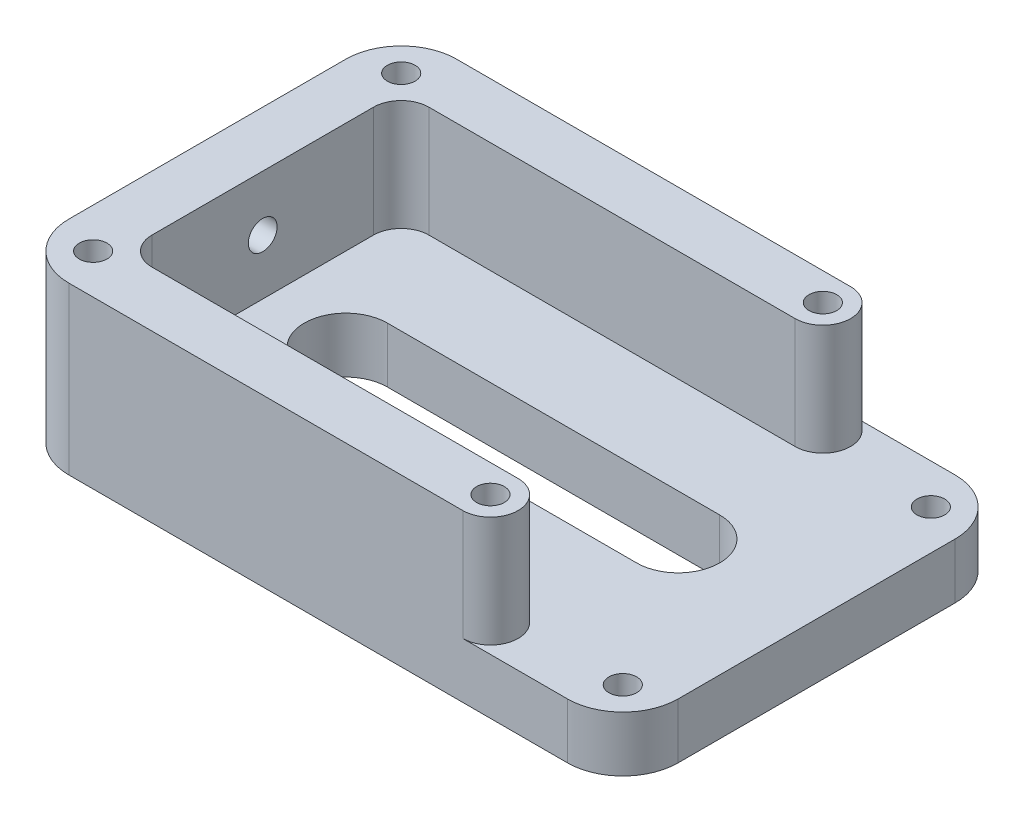
ISO-10303-21;
HEADER;
FILE_DESCRIPTION(('STEP AP214'),'2;1');
FILE_NAME('part.step','',(''),(''),'','','');
FILE_SCHEMA(('AUTOMOTIVE_DESIGN { 1 0 10303 214 1 1 1 1 }'));
ENDSEC;
DATA;
#1=APPLICATION_CONTEXT('core data for automotive mechanical design processes');
#2=APPLICATION_PROTOCOL_DEFINITION('international standard','automotive_design',2000,#1);
#3=PRODUCT_CONTEXT('',#1,'mechanical');
#4=PRODUCT('Part','Part','',(#3));
#5=PRODUCT_RELATED_PRODUCT_CATEGORY('part','',(#4));
#6=PRODUCT_DEFINITION_FORMATION('','',#4);
#7=PRODUCT_DEFINITION_CONTEXT('part definition',#1,'design');
#8=PRODUCT_DEFINITION('design','',#6,#7);
#9=PRODUCT_DEFINITION_SHAPE('','',#8);
#10=(LENGTH_UNIT() NAMED_UNIT(*) SI_UNIT(.MILLI.,.METRE.));
#11=(NAMED_UNIT(*) PLANE_ANGLE_UNIT() SI_UNIT($,.RADIAN.));
#12=(NAMED_UNIT(*) SI_UNIT($,.STERADIAN.) SOLID_ANGLE_UNIT());
#13=UNCERTAINTY_MEASURE_WITH_UNIT(LENGTH_MEASURE(1.E-05),#10,'distance_accuracy_value','');
#14=(GEOMETRIC_REPRESENTATION_CONTEXT(3) GLOBAL_UNCERTAINTY_ASSIGNED_CONTEXT((#13)) GLOBAL_UNIT_ASSIGNED_CONTEXT((#10,
#11,#12)) REPRESENTATION_CONTEXT('',''));
#15=CARTESIAN_POINT('',(0.,0.,0.));
#16=DIRECTION('',(0.,0.,1.));
#17=DIRECTION('',(1.,0.,0.));
#18=AXIS2_PLACEMENT_3D('',#15,#16,#17);
#19=CARTESIAN_POINT('',(30.,10.,0.));
#20=DIRECTION('',(0.,-1.,0.));
#21=DIRECTION('',(0.,0.,-1.));
#22=AXIS2_PLACEMENT_3D('',#19,#20,#21);
#23=CYLINDRICAL_SURFACE('',#22,7.5);
#24=CARTESIAN_POINT('',(30.,0.,0.));
#25=DIRECTION('',(0.,1.,0.));
#26=DIRECTION('',(0.,0.,1.));
#27=AXIS2_PLACEMENT_3D('',#24,#25,#26);
#28=CIRCLE('',#27,7.5);
#29=CARTESIAN_POINT('',(30.,0.,7.5));
#30=VERTEX_POINT('',#29);
#31=CARTESIAN_POINT('',(30.,0.,-7.5));
#32=VERTEX_POINT('',#31);
#33=EDGE_CURVE('E310',#30,#32,#28,.T.);
#34=ORIENTED_EDGE('',*,*,#33,.F.);
#35=DIRECTION('',(0.,-1.,0.));
#36=VECTOR('',#35,1.);
#37=CARTESIAN_POINT('',(30.,10.,7.5));
#38=LINE('',#37,#36);
#39=CARTESIAN_POINT('',(30.,10.,7.5));
#40=VERTEX_POINT('',#39);
#41=EDGE_CURVE('E11',#40,#30,#38,.T.);
#42=ORIENTED_EDGE('',*,*,#41,.F.);
#43=CARTESIAN_POINT('',(30.,10.,0.));
#44=DIRECTION('',(0.,1.,0.));
#45=DIRECTION('',(0.,0.,1.));
#46=AXIS2_PLACEMENT_3D('',#43,#44,#45);
#47=CIRCLE('',#46,7.5);
#48=CARTESIAN_POINT('',(30.,10.,-7.5));
#49=VERTEX_POINT('',#48);
#50=EDGE_CURVE('E274',#40,#49,#47,.T.);
#51=ORIENTED_EDGE('',*,*,#50,.T.);
#52=DIRECTION('',(0.,-1.,0.));
#53=VECTOR('',#52,1.);
#54=CARTESIAN_POINT('',(30.,10.,-7.5));
#55=LINE('',#54,#53);
#56=EDGE_CURVE('E327',#49,#32,#55,.T.);
#57=ORIENTED_EDGE('',*,*,#56,.T.);
#58=EDGE_LOOP('',(#34,#42,#51,#57));
#59=FACE_BOUND('',#58,.T.);
#60=ADVANCED_FACE('F40',(#59),#23,.F.);
#61=CARTESIAN_POINT('',(0.,10.,7.5));
#62=DIRECTION('',(0.,0.,-1.));
#63=DIRECTION('',(-1.,0.,0.));
#64=AXIS2_PLACEMENT_3D('',#61,#62,#63);
#65=PLANE('',#64);
#66=DIRECTION('',(1.,0.,0.));
#67=VECTOR('',#66,1.);
#68=CARTESIAN_POINT('',(0.,0.,7.5));
#69=LINE('',#68,#67);
#70=CARTESIAN_POINT('',(-30.,0.,7.5));
#71=VERTEX_POINT('',#70);
#72=EDGE_CURVE('E313',#71,#30,#69,.T.);
#73=ORIENTED_EDGE('',*,*,#72,.F.);
#74=DIRECTION('',(0.,-1.,0.));
#75=VECTOR('',#74,1.);
#76=CARTESIAN_POINT('',(-30.,10.,7.5));
#77=LINE('',#76,#75);
#78=CARTESIAN_POINT('',(-30.,10.,7.5));
#79=VERTEX_POINT('',#78);
#80=EDGE_CURVE('E49',#79,#71,#77,.T.);
#81=ORIENTED_EDGE('',*,*,#80,.F.);
#82=DIRECTION('',(1.,0.,0.));
#83=VECTOR('',#82,1.);
#84=CARTESIAN_POINT('',(0.,10.,7.5));
#85=LINE('',#84,#83);
#86=EDGE_CURVE('E277',#79,#40,#85,.T.);
#87=ORIENTED_EDGE('',*,*,#86,.T.);
#88=ORIENTED_EDGE('',*,*,#41,.T.);
#89=EDGE_LOOP('',(#73,#81,#87,#88));
#90=FACE_BOUND('',#89,.T.);
#91=ADVANCED_FACE('F412',(#90),#65,.T.);
#92=CARTESIAN_POINT('',(-30.,10.,0.));
#93=DIRECTION('',(0.,-1.,0.));
#94=DIRECTION('',(0.,0.,-1.));
#95=AXIS2_PLACEMENT_3D('',#92,#93,#94);
#96=CYLINDRICAL_SURFACE('',#95,7.5);
#97=CARTESIAN_POINT('',(-30.,0.,0.));
#98=DIRECTION('',(0.,1.,0.));
#99=DIRECTION('',(0.,0.,1.));
#100=AXIS2_PLACEMENT_3D('',#97,#98,#99);
#101=CIRCLE('',#100,7.5);
#102=CARTESIAN_POINT('',(-30.,0.,-7.5));
#103=VERTEX_POINT('',#102);
#104=EDGE_CURVE('E316',#103,#71,#101,.T.);
#105=ORIENTED_EDGE('',*,*,#104,.F.);
#106=DIRECTION('',(0.,-1.,0.));
#107=VECTOR('',#106,1.);
#108=CARTESIAN_POINT('',(-30.,10.,-7.5));
#109=LINE('',#108,#107);
#110=CARTESIAN_POINT('',(-30.,10.,-7.5));
#111=VERTEX_POINT('',#110);
#112=EDGE_CURVE('E329',#111,#103,#109,.T.);
#113=ORIENTED_EDGE('',*,*,#112,.F.);
#114=CARTESIAN_POINT('',(-30.,10.,0.));
#115=DIRECTION('',(0.,1.,0.));
#116=DIRECTION('',(0.,0.,1.));
#117=AXIS2_PLACEMENT_3D('',#114,#115,#116);
#118=CIRCLE('',#117,7.5);
#119=EDGE_CURVE('E280',#111,#79,#118,.T.);
#120=ORIENTED_EDGE('',*,*,#119,.T.);
#121=ORIENTED_EDGE('',*,*,#80,.T.);
#122=EDGE_LOOP('',(#105,#113,#120,#121));
#123=FACE_BOUND('',#122,.T.);
#124=ADVANCED_FACE('F418',(#123),#96,.F.);
#125=CARTESIAN_POINT('',(0.,10.,-35.));
#126=DIRECTION('',(0.,0.,-1.));
#127=DIRECTION('',(-1.,0.,0.));
#128=AXIS2_PLACEMENT_3D('',#125,#126,#127);
#129=PLANE('',#128);
#130=DIRECTION('',(0.,-1.,0.));
#131=VECTOR('',#130,1.);
#132=CARTESIAN_POINT('',(26.1137927144608,30.,-35.));
#133=LINE('',#132,#131);
#134=CARTESIAN_POINT('',(26.1137927144608,30.,-35.));
#135=VERTEX_POINT('',#134);
#136=CARTESIAN_POINT('',(26.1137927144608,10.,-35.));
#137=VERTEX_POINT('',#136);
#138=EDGE_CURVE('E229',#135,#137,#133,.T.);
#139=ORIENTED_EDGE('',*,*,#138,.T.);
#140=DIRECTION('',(1.,0.,0.));
#141=VECTOR('',#140,1.);
#142=CARTESIAN_POINT('',(0.,10.,-35.));
#143=LINE('',#142,#141);
#144=CARTESIAN_POINT('',(45.,10.,-35.));
#145=VERTEX_POINT('',#144);
#146=EDGE_CURVE('E262',#137,#145,#143,.T.);
#147=ORIENTED_EDGE('',*,*,#146,.T.);
#148=DIRECTION('',(0.,-1.,0.));
#149=VECTOR('',#148,1.);
#150=CARTESIAN_POINT('',(45.,10.,-35.));
#151=LINE('',#150,#149);
#152=CARTESIAN_POINT('',(45.,0.,-35.));
#153=VERTEX_POINT('',#152);
#154=EDGE_CURVE('E291',#145,#153,#151,.T.);
#155=ORIENTED_EDGE('',*,*,#154,.T.);
#156=DIRECTION('',(1.,0.,0.));
#157=VECTOR('',#156,1.);
#158=CARTESIAN_POINT('',(0.,0.,-35.));
#159=LINE('',#158,#157);
#160=CARTESIAN_POINT('',(-45.,0.,-35.));
#161=VERTEX_POINT('',#160);
#162=EDGE_CURVE('E261',#161,#153,#159,.T.);
#163=ORIENTED_EDGE('',*,*,#162,.F.);
#164=DIRECTION('',(0.,-1.,0.));
#165=VECTOR('',#164,1.);
#166=CARTESIAN_POINT('',(-45.,10.,-35.));
#167=LINE('',#166,#165);
#168=CARTESIAN_POINT('',(-45.,30.,-35.));
#169=VERTEX_POINT('',#168);
#170=EDGE_CURVE('E44',#169,#161,#167,.T.);
#171=ORIENTED_EDGE('',*,*,#170,.F.);
#172=DIRECTION('',(1.,0.,0.));
#173=VECTOR('',#172,1.);
#174=CARTESIAN_POINT('',(0.,30.,-35.));
#175=LINE('',#174,#173);
#176=EDGE_CURVE('E220',#169,#135,#175,.T.);
#177=ORIENTED_EDGE('',*,*,#176,.T.);
#178=EDGE_LOOP('',(#139,#147,#155,#163,#171,#177));
#179=FACE_BOUND('',#178,.T.);
#180=ADVANCED_FACE('F42',(#179),#129,.T.);
#181=CARTESIAN_POINT('',(-45.,10.,-25.));
#182=DIRECTION('',(0.,-1.,0.));
#183=DIRECTION('',(0.,0.,-1.));
#184=AXIS2_PLACEMENT_3D('',#181,#182,#183);
#185=CYLINDRICAL_SURFACE('',#184,9.99999999999999);
#186=CARTESIAN_POINT('',(-45.,0.,-25.));
#187=DIRECTION('',(0.,1.,0.));
#188=DIRECTION('',(0.,0.,1.));
#189=AXIS2_PLACEMENT_3D('',#186,#187,#188);
#190=CIRCLE('',#189,9.99999999999999);
#191=CARTESIAN_POINT('',(-55.,0.,-25.));
#192=VERTEX_POINT('',#191);
#193=EDGE_CURVE('E293',#161,#192,#190,.T.);
#194=ORIENTED_EDGE('',*,*,#193,.T.);
#195=DIRECTION('',(0.,-1.,0.));
#196=VECTOR('',#195,1.);
#197=CARTESIAN_POINT('',(-55.,10.,-25.));
#198=LINE('',#197,#196);
#199=CARTESIAN_POINT('',(-55.,30.,-25.));
#200=VERTEX_POINT('',#199);
#201=EDGE_CURVE('E345',#200,#192,#198,.T.);
#202=ORIENTED_EDGE('',*,*,#201,.F.);
#203=CARTESIAN_POINT('',(-45.,30.,-25.));
#204=DIRECTION('',(0.,1.,0.));
#205=DIRECTION('',(0.,0.,1.));
#206=AXIS2_PLACEMENT_3D('',#203,#204,#205);
#207=CIRCLE('',#206,9.99999999999999);
#208=EDGE_CURVE('E223',#169,#200,#207,.T.);
#209=ORIENTED_EDGE('',*,*,#208,.F.);
#210=ORIENTED_EDGE('',*,*,#170,.T.);
#211=EDGE_LOOP('',(#194,#202,#209,#210));
#212=FACE_BOUND('',#211,.T.);
#213=ADVANCED_FACE('F353',(#212),#185,.T.);
#214=CARTESIAN_POINT('',(-55.,10.,0.));
#215=DIRECTION('',(1.,0.,0.));
#216=DIRECTION('',(0.,0.,-1.));
#217=AXIS2_PLACEMENT_3D('',#214,#215,#216);
#218=PLANE('',#217);
#219=CARTESIAN_POINT('',(-55.,20.,0.));
#220=DIRECTION('',(1.,0.,0.));
#221=DIRECTION('',(0.,0.,-1.));
#222=AXIS2_PLACEMENT_3D('',#219,#220,#221);
#223=CIRCLE('',#222,2.6);
#224=CARTESIAN_POINT('',(-55.,20.,-2.6));
#225=VERTEX_POINT('',#224);
#226=EDGE_CURVE('E699',#225,#225,#223,.T.);
#227=ORIENTED_EDGE('',*,*,#226,.T.);
#228=EDGE_LOOP('',(#227));
#229=FACE_BOUND('',#228,.T.);
#230=DIRECTION('',(0.,0.,1.));
#231=VECTOR('',#230,1.);
#232=CARTESIAN_POINT('',(-55.,0.,0.));
#233=LINE('',#232,#231);
#234=CARTESIAN_POINT('',(-55.,0.,25.));
#235=VERTEX_POINT('',#234);
#236=EDGE_CURVE('E295',#192,#235,#233,.T.);
#237=ORIENTED_EDGE('',*,*,#236,.T.);
#238=DIRECTION('',(0.,-1.,0.));
#239=VECTOR('',#238,1.);
#240=CARTESIAN_POINT('',(-55.,10.,25.));
#241=LINE('',#240,#239);
#242=CARTESIAN_POINT('',(-55.,30.,25.));
#243=VERTEX_POINT('',#242);
#244=EDGE_CURVE('E343',#243,#235,#241,.T.);
#245=ORIENTED_EDGE('',*,*,#244,.F.);
#246=DIRECTION('',(0.,0.,1.));
#247=VECTOR('',#246,1.);
#248=CARTESIAN_POINT('',(-55.,30.,0.));
#249=LINE('',#248,#247);
#250=EDGE_CURVE('E226',#200,#243,#249,.T.);
#251=ORIENTED_EDGE('',*,*,#250,.F.);
#252=ORIENTED_EDGE('',*,*,#201,.T.);
#253=EDGE_LOOP('',(#237,#245,#251,#252));
#254=FACE_BOUND('',#253,.T.);
#255=ADVANCED_FACE('F378',(#229,#254),#218,.F.);
#256=CARTESIAN_POINT('',(-45.,10.,25.));
#257=DIRECTION('',(0.,-1.,0.));
#258=DIRECTION('',(0.,0.,-1.));
#259=AXIS2_PLACEMENT_3D('',#256,#257,#258);
#260=CYLINDRICAL_SURFACE('',#259,9.99999999999999);
#261=CARTESIAN_POINT('',(-45.,0.,25.));
#262=DIRECTION('',(0.,1.,0.));
#263=DIRECTION('',(0.,0.,1.));
#264=AXIS2_PLACEMENT_3D('',#261,#262,#263);
#265=CIRCLE('',#264,9.99999999999999);
#266=CARTESIAN_POINT('',(-45.,0.,35.));
#267=VERTEX_POINT('',#266);
#268=EDGE_CURVE('E297',#235,#267,#265,.T.);
#269=ORIENTED_EDGE('',*,*,#268,.T.);
#270=DIRECTION('',(0.,-1.,0.));
#271=VECTOR('',#270,1.);
#272=CARTESIAN_POINT('',(-45.,10.,35.));
#273=LINE('',#272,#271);
#274=CARTESIAN_POINT('',(-45.,30.,35.));
#275=VERTEX_POINT('',#274);
#276=EDGE_CURVE('E341',#275,#267,#273,.T.);
#277=ORIENTED_EDGE('',*,*,#276,.F.);
#278=CARTESIAN_POINT('',(-45.,30.,25.));
#279=DIRECTION('',(0.,1.,0.));
#280=DIRECTION('',(0.,0.,1.));
#281=AXIS2_PLACEMENT_3D('',#278,#279,#280);
#282=CIRCLE('',#281,9.99999999999999);
#283=EDGE_CURVE('E186',#243,#275,#282,.T.);
#284=ORIENTED_EDGE('',*,*,#283,.F.);
#285=ORIENTED_EDGE('',*,*,#244,.T.);
#286=EDGE_LOOP('',(#269,#277,#284,#285));
#287=FACE_BOUND('',#286,.T.);
#288=ADVANCED_FACE('F377',(#287),#260,.T.);
#289=CARTESIAN_POINT('',(0.,10.,35.));
#290=DIRECTION('',(0.,0.,-1.));
#291=DIRECTION('',(-1.,0.,0.));
#292=AXIS2_PLACEMENT_3D('',#289,#290,#291);
#293=PLANE('',#292);
#294=DIRECTION('',(1.,0.,0.));
#295=VECTOR('',#294,1.);
#296=CARTESIAN_POINT('',(0.,10.,35.));
#297=LINE('',#296,#295);
#298=CARTESIAN_POINT('',(26.1137927144608,10.,35.));
#299=VERTEX_POINT('',#298);
#300=CARTESIAN_POINT('',(45.,10.,35.));
#301=VERTEX_POINT('',#300);
#302=EDGE_CURVE('E196',#299,#301,#297,.T.);
#303=ORIENTED_EDGE('',*,*,#302,.F.);
#304=DIRECTION('',(0.,-1.,0.));
#305=VECTOR('',#304,1.);
#306=CARTESIAN_POINT('',(26.1137927144608,30.,35.));
#307=LINE('',#306,#305);
#308=CARTESIAN_POINT('',(26.1137927144608,30.,35.));
#309=VERTEX_POINT('',#308);
#310=EDGE_CURVE('E193',#309,#299,#307,.T.);
#311=ORIENTED_EDGE('',*,*,#310,.F.);
#312=DIRECTION('',(1.,0.,0.));
#313=VECTOR('',#312,1.);
#314=CARTESIAN_POINT('',(0.,30.,35.));
#315=LINE('',#314,#313);
#316=EDGE_CURVE('E177',#275,#309,#315,.T.);
#317=ORIENTED_EDGE('',*,*,#316,.F.);
#318=ORIENTED_EDGE('',*,*,#276,.T.);
#319=DIRECTION('',(1.,0.,0.));
#320=VECTOR('',#319,1.);
#321=CARTESIAN_POINT('',(0.,0.,35.));
#322=LINE('',#321,#320);
#323=CARTESIAN_POINT('',(45.,0.,35.));
#324=VERTEX_POINT('',#323);
#325=EDGE_CURVE('E299',#267,#324,#322,.T.);
#326=ORIENTED_EDGE('',*,*,#325,.T.);
#327=DIRECTION('',(0.,-1.,0.));
#328=VECTOR('',#327,1.);
#329=CARTESIAN_POINT('',(45.,10.,35.));
#330=LINE('',#329,#328);
#331=EDGE_CURVE('E338',#301,#324,#330,.T.);
#332=ORIENTED_EDGE('',*,*,#331,.F.);
#333=EDGE_LOOP('',(#303,#311,#317,#318,#326,#332));
#334=FACE_BOUND('',#333,.T.);
#335=ADVANCED_FACE('F194',(#334),#293,.F.);
#336=CARTESIAN_POINT('',(45.,10.,25.));
#337=DIRECTION('',(0.,-1.,0.));
#338=DIRECTION('',(0.,0.,-1.));
#339=AXIS2_PLACEMENT_3D('',#336,#337,#338);
#340=CYLINDRICAL_SURFACE('',#339,10.);
#341=CARTESIAN_POINT('',(45.,0.,25.));
#342=DIRECTION('',(0.,1.,0.));
#343=DIRECTION('',(0.,0.,1.));
#344=AXIS2_PLACEMENT_3D('',#341,#342,#343);
#345=CIRCLE('',#344,10.);
#346=CARTESIAN_POINT('',(55.,0.,25.));
#347=VERTEX_POINT('',#346);
#348=EDGE_CURVE('E301',#324,#347,#345,.T.);
#349=ORIENTED_EDGE('',*,*,#348,.T.);
#350=DIRECTION('',(0.,-1.,0.));
#351=VECTOR('',#350,1.);
#352=CARTESIAN_POINT('',(55.,10.,25.));
#353=LINE('',#352,#351);
#354=CARTESIAN_POINT('',(55.,10.,25.));
#355=VERTEX_POINT('',#354);
#356=EDGE_CURVE('E336',#355,#347,#353,.T.);
#357=ORIENTED_EDGE('',*,*,#356,.F.);
#358=CARTESIAN_POINT('',(45.,10.,25.));
#359=DIRECTION('',(0.,1.,0.));
#360=DIRECTION('',(0.,0.,1.));
#361=AXIS2_PLACEMENT_3D('',#358,#359,#360);
#362=CIRCLE('',#361,10.);
#363=EDGE_CURVE('E266',#301,#355,#362,.T.);
#364=ORIENTED_EDGE('',*,*,#363,.F.);
#365=ORIENTED_EDGE('',*,*,#331,.T.);
#366=EDGE_LOOP('',(#349,#357,#364,#365));
#367=FACE_BOUND('',#366,.T.);
#368=ADVANCED_FACE('F375',(#367),#340,.T.);
#369=CARTESIAN_POINT('',(55.,10.,0.));
#370=DIRECTION('',(1.,0.,0.));
#371=DIRECTION('',(0.,0.,-1.));
#372=AXIS2_PLACEMENT_3D('',#369,#370,#371);
#373=PLANE('',#372);
#374=DIRECTION('',(0.,0.,1.));
#375=VECTOR('',#374,1.);
#376=CARTESIAN_POINT('',(55.,0.,0.));
#377=LINE('',#376,#375);
#378=CARTESIAN_POINT('',(55.,0.,-25.));
#379=VERTEX_POINT('',#378);
#380=EDGE_CURVE('E304',#379,#347,#377,.T.);
#381=ORIENTED_EDGE('',*,*,#380,.F.);
#382=DIRECTION('',(0.,-1.,0.));
#383=VECTOR('',#382,1.);
#384=CARTESIAN_POINT('',(55.,10.,-25.));
#385=LINE('',#384,#383);
#386=CARTESIAN_POINT('',(55.,10.,-25.));
#387=VERTEX_POINT('',#386);
#388=EDGE_CURVE('E334',#387,#379,#385,.T.);
#389=ORIENTED_EDGE('',*,*,#388,.F.);
#390=DIRECTION('',(0.,0.,1.));
#391=VECTOR('',#390,1.);
#392=CARTESIAN_POINT('',(55.,10.,0.));
#393=LINE('',#392,#391);
#394=EDGE_CURVE('E268',#387,#355,#393,.T.);
#395=ORIENTED_EDGE('',*,*,#394,.T.);
#396=ORIENTED_EDGE('',*,*,#356,.T.);
#397=EDGE_LOOP('',(#381,#389,#395,#396));
#398=FACE_BOUND('',#397,.T.);
#399=ADVANCED_FACE('F370',(#398),#373,.T.);
#400=CARTESIAN_POINT('',(47.8033008588991,10.,-27.8033008588991));
#401=DIRECTION('',(0.,-1.,0.));
#402=DIRECTION('',(0.,0.,-1.));
#403=AXIS2_PLACEMENT_3D('',#400,#401,#402);
#404=CYLINDRICAL_SURFACE('',#403,2.5);
#405=CARTESIAN_POINT('',(47.8033008588991,10.,-27.8033008588991));
#406=DIRECTION('',(0.,1.,0.));
#407=DIRECTION('',(0.,0.,1.));
#408=AXIS2_PLACEMENT_3D('',#405,#406,#407);
#409=CIRCLE('',#408,2.5);
#410=CARTESIAN_POINT('',(47.8033008588991,10.,-25.3033008588991));
#411=VERTEX_POINT('',#410);
#412=EDGE_CURVE('E285',#411,#411,#409,.T.);
#413=ORIENTED_EDGE('',*,*,#412,.T.);
#414=EDGE_LOOP('',(#413));
#415=FACE_BOUND('',#414,.T.);
#416=CARTESIAN_POINT('',(47.8033008588991,0.,-27.8033008588991));
#417=DIRECTION('',(0.,1.,0.));
#418=DIRECTION('',(0.,0.,1.));
#419=AXIS2_PLACEMENT_3D('',#416,#417,#418);
#420=CIRCLE('',#419,2.5);
#421=CARTESIAN_POINT('',(47.8033008588991,0.,-25.3033008588991));
#422=VERTEX_POINT('',#421);
#423=EDGE_CURVE('E322',#422,#422,#420,.T.);
#424=ORIENTED_EDGE('',*,*,#423,.F.);
#425=EDGE_LOOP('',(#424));
#426=FACE_BOUND('',#425,.T.);
#427=ADVANCED_FACE('F430',(#415,#426),#404,.F.);
#428=CARTESIAN_POINT('',(0.,10.,-7.5));
#429=DIRECTION('',(0.,0.,-1.));
#430=DIRECTION('',(-1.,0.,0.));
#431=AXIS2_PLACEMENT_3D('',#428,#429,#430);
#432=PLANE('',#431);
#433=DIRECTION('',(1.,0.,0.));
#434=VECTOR('',#433,1.);
#435=CARTESIAN_POINT('',(0.,0.,-7.5));
#436=LINE('',#435,#434);
#437=EDGE_CURVE('E319',#103,#32,#436,.T.);
#438=ORIENTED_EDGE('',*,*,#437,.T.);
#439=ORIENTED_EDGE('',*,*,#56,.F.);
#440=DIRECTION('',(1.,0.,0.));
#441=VECTOR('',#440,1.);
#442=CARTESIAN_POINT('',(0.,10.,-7.5));
#443=LINE('',#442,#441);
#444=EDGE_CURVE('E283',#111,#49,#443,.T.);
#445=ORIENTED_EDGE('',*,*,#444,.F.);
#446=ORIENTED_EDGE('',*,*,#112,.T.);
#447=EDGE_LOOP('',(#438,#439,#445,#446));
#448=FACE_BOUND('',#447,.T.);
#449=ADVANCED_FACE('F427',(#448),#432,.F.);
#450=CARTESIAN_POINT('',(45.,10.,-25.));
#451=DIRECTION('',(0.,-1.,0.));
#452=DIRECTION('',(0.,0.,-1.));
#453=AXIS2_PLACEMENT_3D('',#450,#451,#452);
#454=CYLINDRICAL_SURFACE('',#453,10.);
#455=CARTESIAN_POINT('',(45.,0.,-25.));
#456=DIRECTION('',(0.,1.,0.));
#457=DIRECTION('',(0.,0.,1.));
#458=AXIS2_PLACEMENT_3D('',#455,#456,#457);
#459=CIRCLE('',#458,10.);
#460=EDGE_CURVE('E307',#153,#379,#459,.F.);
#461=ORIENTED_EDGE('',*,*,#460,.F.);
#462=ORIENTED_EDGE('',*,*,#154,.F.);
#463=CARTESIAN_POINT('',(45.,10.,-25.));
#464=DIRECTION('',(0.,1.,0.));
#465=DIRECTION('',(0.,0.,1.));
#466=AXIS2_PLACEMENT_3D('',#463,#464,#465);
#467=CIRCLE('',#466,10.);
#468=EDGE_CURVE('E271',#145,#387,#467,.F.);
#469=ORIENTED_EDGE('',*,*,#468,.T.);
#470=ORIENTED_EDGE('',*,*,#388,.T.);
#471=EDGE_LOOP('',(#461,#462,#469,#470));
#472=FACE_BOUND('',#471,.T.);
#473=ADVANCED_FACE('F366',(#472),#454,.T.);
#474=CARTESIAN_POINT('',(47.8033008588991,10.,27.8033008588991));
#475=DIRECTION('',(0.,-1.,0.));
#476=DIRECTION('',(0.,0.,-1.));
#477=AXIS2_PLACEMENT_3D('',#474,#475,#476);
#478=CYLINDRICAL_SURFACE('',#477,2.5);
#479=CARTESIAN_POINT('',(47.8033008588991,10.,27.8033008588991));
#480=DIRECTION('',(0.,1.,0.));
#481=DIRECTION('',(0.,0.,1.));
#482=AXIS2_PLACEMENT_3D('',#479,#480,#481);
#483=CIRCLE('',#482,2.5);
#484=CARTESIAN_POINT('',(47.8033008588991,10.,30.3033008588991));
#485=VERTEX_POINT('',#484);
#486=EDGE_CURVE('E288',#485,#485,#483,.F.);
#487=ORIENTED_EDGE('',*,*,#486,.F.);
#488=EDGE_LOOP('',(#487));
#489=FACE_BOUND('',#488,.T.);
#490=CARTESIAN_POINT('',(47.8033008588991,0.,27.8033008588991));
#491=DIRECTION('',(0.,1.,0.));
#492=DIRECTION('',(0.,0.,1.));
#493=AXIS2_PLACEMENT_3D('',#490,#491,#492);
#494=CIRCLE('',#493,2.5);
#495=CARTESIAN_POINT('',(47.8033008588991,0.,30.3033008588991));
#496=VERTEX_POINT('',#495);
#497=EDGE_CURVE('E264',#496,#496,#494,.F.);
#498=ORIENTED_EDGE('',*,*,#497,.T.);
#499=EDGE_LOOP('',(#498));
#500=FACE_BOUND('',#499,.T.);
#501=ADVANCED_FACE('F426',(#489,#500),#478,.F.);
#502=CARTESIAN_POINT('',(0.,10.,0.));
#503=DIRECTION('',(0.,1.,0.));
#504=DIRECTION('',(0.,0.,1.));
#505=AXIS2_PLACEMENT_3D('',#502,#503,#504);
#506=PLANE('',#505);
#507=CARTESIAN_POINT('',(26.1137927144608,10.,30.));
#508=DIRECTION('',(0.,1.,0.));
#509=DIRECTION('',(0.,0.,1.));
#510=AXIS2_PLACEMENT_3D('',#507,#508,#509);
#511=CIRCLE('',#510,5.00000000000001);
#512=CARTESIAN_POINT('',(26.1137927144608,10.,25.));
#513=VERTEX_POINT('',#512);
#514=EDGE_CURVE('E259',#299,#513,#511,.T.);
#515=ORIENTED_EDGE('',*,*,#514,.F.);
#516=ORIENTED_EDGE('',*,*,#302,.T.);
#517=ORIENTED_EDGE('',*,*,#363,.T.);
#518=ORIENTED_EDGE('',*,*,#394,.F.);
#519=ORIENTED_EDGE('',*,*,#468,.F.);
#520=ORIENTED_EDGE('',*,*,#146,.F.);
#521=CARTESIAN_POINT('',(26.1137927144608,10.,-30.));
#522=DIRECTION('',(0.,1.,0.));
#523=DIRECTION('',(0.,0.,1.));
#524=AXIS2_PLACEMENT_3D('',#521,#522,#523);
#525=CIRCLE('',#524,5.00000000000001);
#526=CARTESIAN_POINT('',(26.1137927144608,10.,-25.));
#527=VERTEX_POINT('',#526);
#528=EDGE_CURVE('E198',#137,#527,#525,.F.);
#529=ORIENTED_EDGE('',*,*,#528,.T.);
#530=DIRECTION('',(-1.,0.,0.));
#531=VECTOR('',#530,1.);
#532=CARTESIAN_POINT('',(0.,10.,-25.));
#533=LINE('',#532,#531);
#534=CARTESIAN_POINT('',(-40.,10.,-25.));
#535=VERTEX_POINT('',#534);
#536=EDGE_CURVE('E249',#527,#535,#533,.T.);
#537=ORIENTED_EDGE('',*,*,#536,.T.);
#538=CARTESIAN_POINT('',(-40.,10.,-20.));
#539=DIRECTION('',(0.,1.,0.));
#540=DIRECTION('',(0.,0.,1.));
#541=AXIS2_PLACEMENT_3D('',#538,#539,#540);
#542=CIRCLE('',#541,5.);
#543=CARTESIAN_POINT('',(-45.,10.,-20.));
#544=VERTEX_POINT('',#543);
#545=EDGE_CURVE('E251',#544,#535,#542,.F.);
#546=ORIENTED_EDGE('',*,*,#545,.F.);
#547=DIRECTION('',(0.,0.,-1.));
#548=VECTOR('',#547,1.);
#549=CARTESIAN_POINT('',(-45.,10.,0.));
#550=LINE('',#549,#548);
#551=CARTESIAN_POINT('',(-45.,10.,20.));
#552=VERTEX_POINT('',#551);
#553=EDGE_CURVE('E254',#552,#544,#550,.T.);
#554=ORIENTED_EDGE('',*,*,#553,.F.);
#555=CARTESIAN_POINT('',(-40.,10.,20.));
#556=DIRECTION('',(0.,1.,0.));
#557=DIRECTION('',(0.,0.,1.));
#558=AXIS2_PLACEMENT_3D('',#555,#556,#557);
#559=CIRCLE('',#558,5.);
#560=CARTESIAN_POINT('',(-40.,10.,25.));
#561=VERTEX_POINT('',#560);
#562=EDGE_CURVE('E62',#552,#561,#559,.T.);
#563=ORIENTED_EDGE('',*,*,#562,.T.);
#564=DIRECTION('',(-1.,0.,0.));
#565=VECTOR('',#564,1.);
#566=CARTESIAN_POINT('',(0.,10.,25.));
#567=LINE('',#566,#565);
#568=EDGE_CURVE('E57',#513,#561,#567,.T.);
#569=ORIENTED_EDGE('',*,*,#568,.F.);
#570=EDGE_LOOP('',(#515,#516,#517,#518,#519,#520,#529,#537,#546,#554,#563,#569));
#571=FACE_BOUND('',#570,.T.);
#572=ORIENTED_EDGE('',*,*,#50,.F.);
#573=ORIENTED_EDGE('',*,*,#86,.F.);
#574=ORIENTED_EDGE('',*,*,#119,.F.);
#575=ORIENTED_EDGE('',*,*,#444,.T.);
#576=EDGE_LOOP('',(#572,#573,#574,#575));
#577=FACE_BOUND('',#576,.T.);
#578=ORIENTED_EDGE('',*,*,#412,.F.);
#579=EDGE_LOOP('',(#578));
#580=FACE_BOUND('',#579,.T.);
#581=ORIENTED_EDGE('',*,*,#486,.T.);
#582=EDGE_LOOP('',(#581));
#583=FACE_BOUND('',#582,.T.);
#584=ADVANCED_FACE('F386',(#571,#577,#580,#583),#506,.T.);
#585=CARTESIAN_POINT('',(0.,0.,0.));
#586=DIRECTION('',(0.,1.,0.));
#587=DIRECTION('',(0.,0.,1.));
#588=AXIS2_PLACEMENT_3D('',#585,#586,#587);
#589=PLANE('',#588);
#590=CARTESIAN_POINT('',(-47.8033008588991,0.,27.8033008588991));
#591=DIRECTION('',(0.,1.,0.));
#592=DIRECTION('',(0.,0.,-1.));
#593=AXIS2_PLACEMENT_3D('',#590,#591,#592);
#594=CIRCLE('',#593,2.5);
#595=CARTESIAN_POINT('',(-47.8033008588991,0.,25.3033008588991));
#596=VERTEX_POINT('',#595);
#597=EDGE_CURVE('E711',#596,#596,#594,.T.);
#598=ORIENTED_EDGE('',*,*,#597,.T.);
#599=EDGE_LOOP('',(#598));
#600=FACE_BOUND('',#599,.T.);
#601=CARTESIAN_POINT('',(26.1137927144608,0.,-30.));
#602=DIRECTION('',(0.,1.,0.));
#603=DIRECTION('',(0.,0.,1.));
#604=AXIS2_PLACEMENT_3D('',#601,#602,#603);
#605=CIRCLE('',#604,2.5);
#606=CARTESIAN_POINT('',(26.1137927144608,0.,-27.5));
#607=VERTEX_POINT('',#606);
#608=EDGE_CURVE('E718',#607,#607,#605,.T.);
#609=ORIENTED_EDGE('',*,*,#608,.T.);
#610=EDGE_LOOP('',(#609));
#611=FACE_BOUND('',#610,.T.);
#612=CARTESIAN_POINT('',(26.1137927144608,0.,30.));
#613=DIRECTION('',(0.,1.,0.));
#614=DIRECTION('',(0.,0.,-1.));
#615=AXIS2_PLACEMENT_3D('',#612,#613,#614);
#616=CIRCLE('',#615,2.5);
#617=CARTESIAN_POINT('',(26.1137927144608,0.,27.5));
#618=VERTEX_POINT('',#617);
#619=EDGE_CURVE('E705',#618,#618,#616,.T.);
#620=ORIENTED_EDGE('',*,*,#619,.T.);
#621=EDGE_LOOP('',(#620));
#622=FACE_BOUND('',#621,.T.);
#623=CARTESIAN_POINT('',(-47.8033008588991,0.,-27.8033008588991));
#624=DIRECTION('',(0.,1.,0.));
#625=DIRECTION('',(0.,0.,1.));
#626=AXIS2_PLACEMENT_3D('',#623,#624,#625);
#627=CIRCLE('',#626,2.5);
#628=CARTESIAN_POINT('',(-47.8033008588991,0.,-25.3033008588991));
#629=VERTEX_POINT('',#628);
#630=EDGE_CURVE('E189',#629,#629,#627,.T.);
#631=ORIENTED_EDGE('',*,*,#630,.T.);
#632=EDGE_LOOP('',(#631));
#633=FACE_BOUND('',#632,.T.);
#634=ORIENTED_EDGE('',*,*,#348,.F.);
#635=ORIENTED_EDGE('',*,*,#325,.F.);
#636=ORIENTED_EDGE('',*,*,#268,.F.);
#637=ORIENTED_EDGE('',*,*,#236,.F.);
#638=ORIENTED_EDGE('',*,*,#193,.F.);
#639=ORIENTED_EDGE('',*,*,#162,.T.);
#640=ORIENTED_EDGE('',*,*,#460,.T.);
#641=ORIENTED_EDGE('',*,*,#380,.T.);
#642=EDGE_LOOP('',(#634,#635,#636,#637,#638,#639,#640,#641));
#643=FACE_BOUND('',#642,.T.);
#644=ORIENTED_EDGE('',*,*,#33,.T.);
#645=ORIENTED_EDGE('',*,*,#437,.F.);
#646=ORIENTED_EDGE('',*,*,#104,.T.);
#647=ORIENTED_EDGE('',*,*,#72,.T.);
#648=EDGE_LOOP('',(#644,#645,#646,#647));
#649=FACE_BOUND('',#648,.T.);
#650=ORIENTED_EDGE('',*,*,#423,.T.);
#651=EDGE_LOOP('',(#650));
#652=FACE_BOUND('',#651,.T.);
#653=ORIENTED_EDGE('',*,*,#497,.F.);
#654=EDGE_LOOP('',(#653));
#655=FACE_BOUND('',#654,.T.);
#656=ADVANCED_FACE('F359',(#600,#611,#622,#633,#643,#649,#652,#655),#589,.F.);
#657=CARTESIAN_POINT('',(26.1137927144608,30.,30.));
#658=DIRECTION('',(0.,-1.,0.));
#659=DIRECTION('',(0.,0.,-1.));
#660=AXIS2_PLACEMENT_3D('',#657,#658,#659);
#661=CYLINDRICAL_SURFACE('',#660,5.00000000000001);
#662=ORIENTED_EDGE('',*,*,#310,.T.);
#663=ORIENTED_EDGE('',*,*,#514,.T.);
#664=DIRECTION('',(0.,-1.,0.));
#665=VECTOR('',#664,1.);
#666=CARTESIAN_POINT('',(26.1137927144608,30.,25.));
#667=LINE('',#666,#665);
#668=CARTESIAN_POINT('',(26.1137927144608,30.,25.));
#669=VERTEX_POINT('',#668);
#670=EDGE_CURVE('E199',#669,#513,#667,.T.);
#671=ORIENTED_EDGE('',*,*,#670,.F.);
#672=CARTESIAN_POINT('',(26.1137927144608,30.,30.));
#673=DIRECTION('',(0.,1.,0.));
#674=DIRECTION('',(0.,0.,1.));
#675=AXIS2_PLACEMENT_3D('',#672,#673,#674);
#676=CIRCLE('',#675,5.00000000000001);
#677=EDGE_CURVE('E182',#669,#309,#676,.F.);
#678=ORIENTED_EDGE('',*,*,#677,.T.);
#679=EDGE_LOOP('',(#662,#663,#671,#678));
#680=FACE_BOUND('',#679,.T.);
#681=ADVANCED_FACE('F201',(#680),#661,.T.);
#682=CARTESIAN_POINT('',(0.,30.,25.));
#683=DIRECTION('',(0.,0.,-1.));
#684=DIRECTION('',(-1.,0.,0.));
#685=AXIS2_PLACEMENT_3D('',#682,#683,#684);
#686=PLANE('',#685);
#687=ORIENTED_EDGE('',*,*,#670,.T.);
#688=ORIENTED_EDGE('',*,*,#568,.T.);
#689=DIRECTION('',(0.,-1.,0.));
#690=VECTOR('',#689,1.);
#691=CARTESIAN_POINT('',(-40.,30.,25.));
#692=LINE('',#691,#690);
#693=CARTESIAN_POINT('',(-40.,30.,25.));
#694=VERTEX_POINT('',#693);
#695=EDGE_CURVE('E244',#694,#561,#692,.T.);
#696=ORIENTED_EDGE('',*,*,#695,.F.);
#697=DIRECTION('',(1.,0.,0.));
#698=VECTOR('',#697,1.);
#699=CARTESIAN_POINT('',(0.,30.,25.));
#700=LINE('',#699,#698);
#701=EDGE_CURVE('E203',#694,#669,#700,.T.);
#702=ORIENTED_EDGE('',*,*,#701,.T.);
#703=EDGE_LOOP('',(#687,#688,#696,#702));
#704=FACE_BOUND('',#703,.T.);
#705=ADVANCED_FACE('F402',(#704),#686,.T.);
#706=CARTESIAN_POINT('',(-40.,30.,20.));
#707=DIRECTION('',(0.,-1.,0.));
#708=DIRECTION('',(0.,0.,-1.));
#709=AXIS2_PLACEMENT_3D('',#706,#707,#708);
#710=CYLINDRICAL_SURFACE('',#709,5.);
#711=ORIENTED_EDGE('',*,*,#562,.F.);
#712=DIRECTION('',(0.,-1.,0.));
#713=VECTOR('',#712,1.);
#714=CARTESIAN_POINT('',(-45.,30.,20.));
#715=LINE('',#714,#713);
#716=CARTESIAN_POINT('',(-45.,30.,20.));
#717=VERTEX_POINT('',#716);
#718=EDGE_CURVE('E241',#717,#552,#715,.T.);
#719=ORIENTED_EDGE('',*,*,#718,.F.);
#720=CARTESIAN_POINT('',(-40.,30.,20.));
#721=DIRECTION('',(0.,1.,0.));
#722=DIRECTION('',(0.,0.,1.));
#723=AXIS2_PLACEMENT_3D('',#720,#721,#722);
#724=CIRCLE('',#723,5.);
#725=EDGE_CURVE('E205',#694,#717,#724,.F.);
#726=ORIENTED_EDGE('',*,*,#725,.F.);
#727=ORIENTED_EDGE('',*,*,#695,.T.);
#728=EDGE_LOOP('',(#711,#719,#726,#727));
#729=FACE_BOUND('',#728,.T.);
#730=ADVANCED_FACE('F400',(#729),#710,.F.);
#731=CARTESIAN_POINT('',(-45.,30.,0.));
#732=DIRECTION('',(1.,0.,0.));
#733=DIRECTION('',(0.,0.,-1.));
#734=AXIS2_PLACEMENT_3D('',#731,#732,#733);
#735=PLANE('',#734);
#736=CARTESIAN_POINT('',(-45.,20.,0.));
#737=DIRECTION('',(1.,0.,0.));
#738=DIRECTION('',(0.,0.,-1.));
#739=AXIS2_PLACEMENT_3D('',#736,#737,#738);
#740=CIRCLE('',#739,2.6);
#741=CARTESIAN_POINT('',(-45.,20.,-2.6));
#742=VERTEX_POINT('',#741);
#743=EDGE_CURVE('E698',#742,#742,#740,.T.);
#744=ORIENTED_EDGE('',*,*,#743,.F.);
#745=EDGE_LOOP('',(#744));
#746=FACE_BOUND('',#745,.T.);
#747=ORIENTED_EDGE('',*,*,#718,.T.);
#748=ORIENTED_EDGE('',*,*,#553,.T.);
#749=DIRECTION('',(0.,-1.,0.));
#750=VECTOR('',#749,1.);
#751=CARTESIAN_POINT('',(-45.,30.,-20.));
#752=LINE('',#751,#750);
#753=CARTESIAN_POINT('',(-45.,30.,-20.));
#754=VERTEX_POINT('',#753);
#755=EDGE_CURVE('E238',#754,#544,#752,.T.);
#756=ORIENTED_EDGE('',*,*,#755,.F.);
#757=DIRECTION('',(0.,0.,1.));
#758=VECTOR('',#757,1.);
#759=CARTESIAN_POINT('',(-45.,30.,0.));
#760=LINE('',#759,#758);
#761=EDGE_CURVE('E210',#754,#717,#760,.T.);
#762=ORIENTED_EDGE('',*,*,#761,.T.);
#763=EDGE_LOOP('',(#747,#748,#756,#762));
#764=FACE_BOUND('',#763,.T.);
#765=ADVANCED_FACE('F395',(#746,#764),#735,.T.);
#766=CARTESIAN_POINT('',(-40.,30.,-20.));
#767=DIRECTION('',(0.,-1.,0.));
#768=DIRECTION('',(0.,0.,-1.));
#769=AXIS2_PLACEMENT_3D('',#766,#767,#768);
#770=CYLINDRICAL_SURFACE('',#769,5.);
#771=ORIENTED_EDGE('',*,*,#755,.T.);
#772=ORIENTED_EDGE('',*,*,#545,.T.);
#773=DIRECTION('',(0.,-1.,0.));
#774=VECTOR('',#773,1.);
#775=CARTESIAN_POINT('',(-40.,30.,-25.));
#776=LINE('',#775,#774);
#777=CARTESIAN_POINT('',(-40.,30.,-25.));
#778=VERTEX_POINT('',#777);
#779=EDGE_CURVE('E235',#778,#535,#776,.T.);
#780=ORIENTED_EDGE('',*,*,#779,.F.);
#781=CARTESIAN_POINT('',(-40.,30.,-20.));
#782=DIRECTION('',(0.,1.,0.));
#783=DIRECTION('',(0.,0.,1.));
#784=AXIS2_PLACEMENT_3D('',#781,#782,#783);
#785=CIRCLE('',#784,5.);
#786=EDGE_CURVE('E213',#778,#754,#785,.T.);
#787=ORIENTED_EDGE('',*,*,#786,.T.);
#788=EDGE_LOOP('',(#771,#772,#780,#787));
#789=FACE_BOUND('',#788,.T.);
#790=ADVANCED_FACE('F393',(#789),#770,.F.);
#791=CARTESIAN_POINT('',(0.,30.,-25.));
#792=DIRECTION('',(0.,0.,-1.));
#793=DIRECTION('',(-1.,0.,0.));
#794=AXIS2_PLACEMENT_3D('',#791,#792,#793);
#795=PLANE('',#794);
#796=ORIENTED_EDGE('',*,*,#536,.F.);
#797=DIRECTION('',(0.,-1.,0.));
#798=VECTOR('',#797,1.);
#799=CARTESIAN_POINT('',(26.1137927144608,30.,-25.));
#800=LINE('',#799,#798);
#801=CARTESIAN_POINT('',(26.1137927144608,30.,-25.));
#802=VERTEX_POINT('',#801);
#803=EDGE_CURVE('E232',#802,#527,#800,.T.);
#804=ORIENTED_EDGE('',*,*,#803,.F.);
#805=DIRECTION('',(1.,0.,0.));
#806=VECTOR('',#805,1.);
#807=CARTESIAN_POINT('',(0.,30.,-25.));
#808=LINE('',#807,#806);
#809=EDGE_CURVE('E216',#778,#802,#808,.T.);
#810=ORIENTED_EDGE('',*,*,#809,.F.);
#811=ORIENTED_EDGE('',*,*,#779,.T.);
#812=EDGE_LOOP('',(#796,#804,#810,#811));
#813=FACE_BOUND('',#812,.T.);
#814=ADVANCED_FACE('F389',(#813),#795,.F.);
#815=CARTESIAN_POINT('',(26.1137927144608,30.,-30.));
#816=DIRECTION('',(0.,-1.,0.));
#817=DIRECTION('',(0.,0.,-1.));
#818=AXIS2_PLACEMENT_3D('',#815,#816,#817);
#819=CYLINDRICAL_SURFACE('',#818,5.00000000000001);
#820=ORIENTED_EDGE('',*,*,#528,.F.);
#821=ORIENTED_EDGE('',*,*,#138,.F.);
#822=CARTESIAN_POINT('',(26.1137927144608,30.,-30.));
#823=DIRECTION('',(0.,1.,0.));
#824=DIRECTION('',(0.,0.,1.));
#825=AXIS2_PLACEMENT_3D('',#822,#823,#824);
#826=CIRCLE('',#825,5.00000000000001);
#827=EDGE_CURVE('E218',#802,#135,#826,.T.);
#828=ORIENTED_EDGE('',*,*,#827,.F.);
#829=ORIENTED_EDGE('',*,*,#803,.T.);
#830=EDGE_LOOP('',(#820,#821,#828,#829));
#831=FACE_BOUND('',#830,.T.);
#832=ADVANCED_FACE('F383',(#831),#819,.T.);
#833=CARTESIAN_POINT('',(0.,30.,0.));
#834=DIRECTION('',(0.,1.,0.));
#835=DIRECTION('',(0.,0.,1.));
#836=AXIS2_PLACEMENT_3D('',#833,#834,#835);
#837=PLANE('',#836);
#838=CARTESIAN_POINT('',(-47.8033008588991,30.,27.8033008588991));
#839=DIRECTION('',(0.,1.,0.));
#840=DIRECTION('',(0.,0.,-1.));
#841=AXIS2_PLACEMENT_3D('',#838,#839,#840);
#842=CIRCLE('',#841,2.5);
#843=CARTESIAN_POINT('',(-47.8033008588991,30.,25.3033008588991));
#844=VERTEX_POINT('',#843);
#845=EDGE_CURVE('E715',#844,#844,#842,.T.);
#846=ORIENTED_EDGE('',*,*,#845,.F.);
#847=EDGE_LOOP('',(#846));
#848=FACE_BOUND('',#847,.T.);
#849=CARTESIAN_POINT('',(26.1137927144608,30.,-30.));
#850=DIRECTION('',(0.,1.,0.));
#851=DIRECTION('',(0.,0.,1.));
#852=AXIS2_PLACEMENT_3D('',#849,#850,#851);
#853=CIRCLE('',#852,2.5);
#854=CARTESIAN_POINT('',(26.1137927144608,30.,-27.5));
#855=VERTEX_POINT('',#854);
#856=EDGE_CURVE('E708',#855,#855,#853,.T.);
#857=ORIENTED_EDGE('',*,*,#856,.F.);
#858=EDGE_LOOP('',(#857));
#859=FACE_BOUND('',#858,.T.);
#860=CARTESIAN_POINT('',(26.1137927144608,30.,30.));
#861=DIRECTION('',(0.,1.,0.));
#862=DIRECTION('',(0.,0.,-1.));
#863=AXIS2_PLACEMENT_3D('',#860,#861,#862);
#864=CIRCLE('',#863,2.5);
#865=CARTESIAN_POINT('',(26.1137927144608,30.,27.5));
#866=VERTEX_POINT('',#865);
#867=EDGE_CURVE('E702',#866,#866,#864,.T.);
#868=ORIENTED_EDGE('',*,*,#867,.F.);
#869=EDGE_LOOP('',(#868));
#870=FACE_BOUND('',#869,.T.);
#871=CARTESIAN_POINT('',(-47.8033008588991,30.,-27.8033008588991));
#872=DIRECTION('',(0.,1.,0.));
#873=DIRECTION('',(0.,0.,1.));
#874=AXIS2_PLACEMENT_3D('',#871,#872,#873);
#875=CIRCLE('',#874,2.5);
#876=CARTESIAN_POINT('',(-47.8033008588991,30.,-25.3033008588991));
#877=VERTEX_POINT('',#876);
#878=EDGE_CURVE('E714',#877,#877,#875,.T.);
#879=ORIENTED_EDGE('',*,*,#878,.F.);
#880=EDGE_LOOP('',(#879));
#881=FACE_BOUND('',#880,.T.);
#882=ORIENTED_EDGE('',*,*,#316,.T.);
#883=ORIENTED_EDGE('',*,*,#677,.F.);
#884=ORIENTED_EDGE('',*,*,#701,.F.);
#885=ORIENTED_EDGE('',*,*,#725,.T.);
#886=ORIENTED_EDGE('',*,*,#761,.F.);
#887=ORIENTED_EDGE('',*,*,#786,.F.);
#888=ORIENTED_EDGE('',*,*,#809,.T.);
#889=ORIENTED_EDGE('',*,*,#827,.T.);
#890=ORIENTED_EDGE('',*,*,#176,.F.);
#891=ORIENTED_EDGE('',*,*,#208,.T.);
#892=ORIENTED_EDGE('',*,*,#250,.T.);
#893=ORIENTED_EDGE('',*,*,#283,.T.);
#894=EDGE_LOOP('',(#882,#883,#884,#885,#886,#887,#888,#889,#890,#891,#892,#893));
#895=FACE_BOUND('',#894,.T.);
#896=ADVANCED_FACE('F179',(#848,#859,#870,#881,#895),#837,.T.);
#897=CARTESIAN_POINT('',(-47.8033008588991,0.,-27.8033008588991));
#898=DIRECTION('',(0.,1.,0.));
#899=DIRECTION('',(0.,0.,1.));
#900=AXIS2_PLACEMENT_3D('',#897,#898,#899);
#901=CYLINDRICAL_SURFACE('',#900,2.5);
#902=ORIENTED_EDGE('',*,*,#630,.F.);
#903=EDGE_LOOP('',(#902));
#904=FACE_BOUND('',#903,.T.);
#905=ORIENTED_EDGE('',*,*,#878,.T.);
#906=EDGE_LOOP('',(#905));
#907=FACE_BOUND('',#906,.T.);
#908=ADVANCED_FACE('F523',(#904,#907),#901,.F.);
#909=CARTESIAN_POINT('',(26.1137927144608,0.,30.));
#910=DIRECTION('',(0.,1.,0.));
#911=DIRECTION('',(0.,0.,1.));
#912=AXIS2_PLACEMENT_3D('',#909,#910,#911);
#913=CYLINDRICAL_SURFACE('',#912,2.5);
#914=ORIENTED_EDGE('',*,*,#619,.F.);
#915=EDGE_LOOP('',(#914));
#916=FACE_BOUND('',#915,.T.);
#917=ORIENTED_EDGE('',*,*,#867,.T.);
#918=EDGE_LOOP('',(#917));
#919=FACE_BOUND('',#918,.T.);
#920=ADVANCED_FACE('F531',(#916,#919),#913,.F.);
#921=CARTESIAN_POINT('',(26.1137927144608,0.,-30.));
#922=DIRECTION('',(0.,1.,0.));
#923=DIRECTION('',(0.,0.,1.));
#924=AXIS2_PLACEMENT_3D('',#921,#922,#923);
#925=CYLINDRICAL_SURFACE('',#924,2.5);
#926=ORIENTED_EDGE('',*,*,#608,.F.);
#927=EDGE_LOOP('',(#926));
#928=FACE_BOUND('',#927,.T.);
#929=ORIENTED_EDGE('',*,*,#856,.T.);
#930=EDGE_LOOP('',(#929));
#931=FACE_BOUND('',#930,.T.);
#932=ADVANCED_FACE('F539',(#928,#931),#925,.F.);
#933=CARTESIAN_POINT('',(-47.8033008588991,0.,27.8033008588991));
#934=DIRECTION('',(0.,1.,0.));
#935=DIRECTION('',(0.,0.,1.));
#936=AXIS2_PLACEMENT_3D('',#933,#934,#935);
#937=CYLINDRICAL_SURFACE('',#936,2.5);
#938=ORIENTED_EDGE('',*,*,#597,.F.);
#939=EDGE_LOOP('',(#938));
#940=FACE_BOUND('',#939,.T.);
#941=ORIENTED_EDGE('',*,*,#845,.T.);
#942=EDGE_LOOP('',(#941));
#943=FACE_BOUND('',#942,.T.);
#944=ADVANCED_FACE('F547',(#940,#943),#937,.F.);
#945=CARTESIAN_POINT('',(-56.,20.,0.));
#946=DIRECTION('',(1.,0.,0.));
#947=DIRECTION('',(0.,0.,-1.));
#948=AXIS2_PLACEMENT_3D('',#945,#946,#947);
#949=CYLINDRICAL_SURFACE('',#948,2.6);
#950=ORIENTED_EDGE('',*,*,#743,.T.);
#951=EDGE_LOOP('',(#950));
#952=FACE_BOUND('',#951,.T.);
#953=ORIENTED_EDGE('',*,*,#226,.F.);
#954=EDGE_LOOP('',(#953));
#955=FACE_BOUND('',#954,.T.);
#956=ADVANCED_FACE('F555',(#952,#955),#949,.F.);
#957=CLOSED_SHELL('',(#60,#91,#124,#180,#213,#255,#288,#335,#368,#399,#427,#449,#473,#501,#584,
#656,#681,#705,#730,#765,#790,#814,#832,#896,#908,#920,#932,#944,#956));
#958=MANIFOLD_SOLID_BREP('B2',#957);
#959=ADVANCED_BREP_SHAPE_REPRESENTATION('',(#18,#958),#14);
#960=SHAPE_DEFINITION_REPRESENTATION(#9,#959);
ENDSEC;
END-ISO-10303-21;
